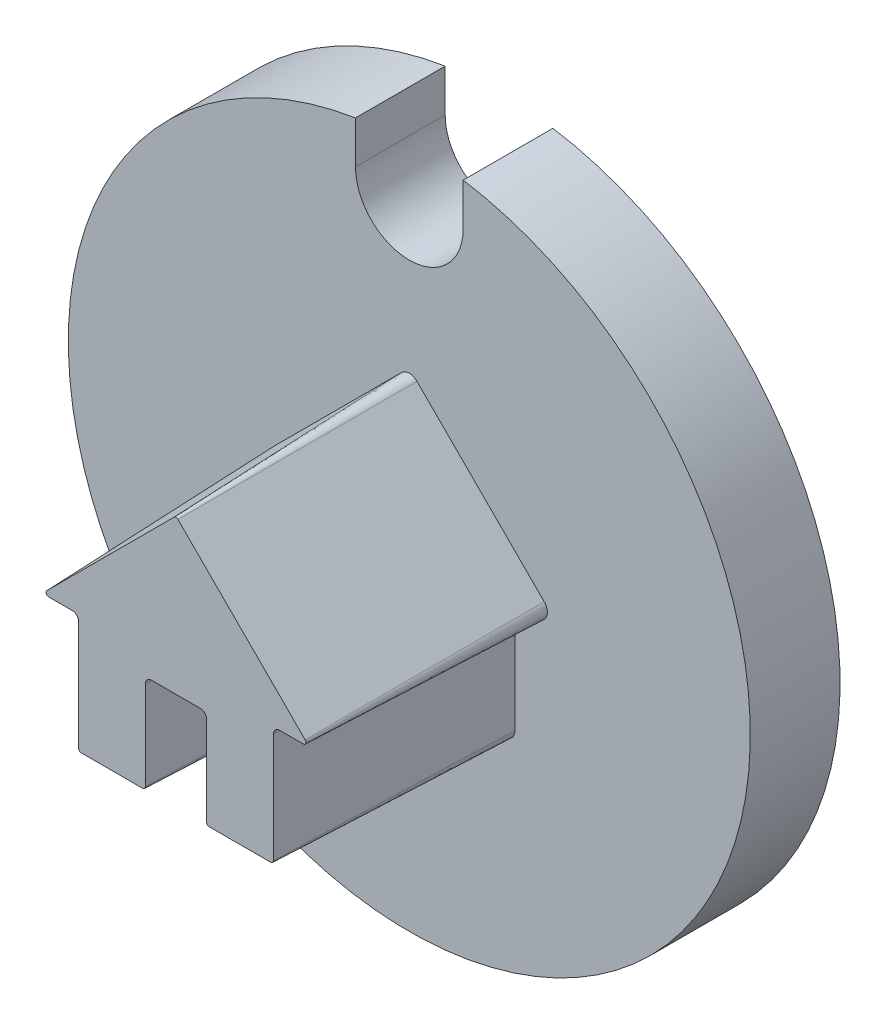
ISO-10303-21;
HEADER;
FILE_DESCRIPTION(('STEP AP214'),'2;1');
FILE_NAME('part.step','',(''),(''),'','','');
FILE_SCHEMA(('AUTOMOTIVE_DESIGN { 1 0 10303 214 1 1 1 1 }'));
ENDSEC;
DATA;
#1=APPLICATION_CONTEXT('core data for automotive mechanical design processes');
#2=APPLICATION_PROTOCOL_DEFINITION('international standard','automotive_design',2000,#1);
#3=PRODUCT_CONTEXT('',#1,'mechanical');
#4=PRODUCT('Part','Part','',(#3));
#5=PRODUCT_RELATED_PRODUCT_CATEGORY('part','',(#4));
#6=PRODUCT_DEFINITION_FORMATION('','',#4);
#7=PRODUCT_DEFINITION_CONTEXT('part definition',#1,'design');
#8=PRODUCT_DEFINITION('design','',#6,#7);
#9=PRODUCT_DEFINITION_SHAPE('','',#8);
#10=(LENGTH_UNIT() NAMED_UNIT(*) SI_UNIT(.MILLI.,.METRE.));
#11=(NAMED_UNIT(*) PLANE_ANGLE_UNIT() SI_UNIT($,.RADIAN.));
#12=(NAMED_UNIT(*) SI_UNIT($,.STERADIAN.) SOLID_ANGLE_UNIT());
#13=UNCERTAINTY_MEASURE_WITH_UNIT(LENGTH_MEASURE(1.E-05),#10,'distance_accuracy_value','');
#14=(GEOMETRIC_REPRESENTATION_CONTEXT(3) GLOBAL_UNCERTAINTY_ASSIGNED_CONTEXT((#13)) GLOBAL_UNIT_ASSIGNED_CONTEXT((#10,
#11,#12)) REPRESENTATION_CONTEXT('',''));
#15=CARTESIAN_POINT('',(0.,0.,0.));
#16=DIRECTION('',(0.,0.,1.));
#17=DIRECTION('',(1.,0.,0.));
#18=AXIS2_PLACEMENT_3D('',#15,#16,#17);
#19=CARTESIAN_POINT('',(0.,0.05,9.));
#20=DIRECTION('',(0.,-0.999390827019096,0.0348994967025009));
#21=DIRECTION('',(0.,-0.0348994967025009,-0.999390827019096));
#22=AXIS2_PLACEMENT_3D('',#19,#20,#21);
#23=PLANE('',#22);
#24=DIRECTION('',(0.0348782627423748,-0.0348782627423746,-0.998782765958718));
#25=VECTOR('',#24,1.);
#26=CARTESIAN_POINT('',(2.88834211230278,-0.125,3.98865567548976));
#27=LINE('',#26,#25);
#28=CARTESIAN_POINT('',(2.88834211230275,-0.125000000002556,3.98865567546541));
#29=VERTEX_POINT('',#28);
#30=CARTESIAN_POINT('',(2.94032711399914,-0.17698500169636,2.5));
#31=VERTEX_POINT('',#30);
#32=EDGE_CURVE('E196',#29,#31,#27,.T.);
#33=ORIENTED_EDGE('',*,*,#32,.T.);
#34=DIRECTION('',(1.,0.,0.));
#35=VECTOR('',#34,1.);
#36=CARTESIAN_POINT('',(0.,-0.17698500169636,2.5));
#37=LINE('',#36,#35);
#38=CARTESIAN_POINT('',(3.54431475582672,-0.176985001698563,2.50000000004093));
#39=VERTEX_POINT('',#38);
#40=EDGE_CURVE('E200',#31,#39,#37,.T.);
#41=ORIENTED_EDGE('',*,*,#40,.T.);
#42=DIRECTION('',(0.,0.034899496702501,0.999390827019096));
#43=VECTOR('',#42,1.);
#44=CARTESIAN_POINT('',(3.54431475582779,-17425.7282633075,-499000.));
#45=LINE('',#44,#43);
#46=CARTESIAN_POINT('',(3.54431475582672,0.0499999999973937,9.00000000003934));
#47=VERTEX_POINT('',#46);
#48=EDGE_CURVE('E301',#47,#39,#45,.F.);
#49=ORIENTED_EDGE('',*,*,#48,.F.);
#50=DIRECTION('',(1.,0.,0.));
#51=VECTOR('',#50,1.);
#52=CARTESIAN_POINT('',(0.,0.05,9.));
#53=LINE('',#52,#51);
#54=CARTESIAN_POINT('',(2.88834211230278,0.0499999999986386,8.9999999999967));
#55=VERTEX_POINT('',#54);
#56=EDGE_CURVE('E206',#47,#55,#53,.F.);
#57=ORIENTED_EDGE('',*,*,#56,.T.);
#58=DIRECTION('',(0.,-0.0348994967025009,-0.999390827019096));
#59=VECTOR('',#58,1.);
#60=CARTESIAN_POINT('',(2.88834211230385,17425.1996894567,499000.));
#61=LINE('',#60,#59);
#62=EDGE_CURVE('E203',#55,#29,#61,.T.);
#63=ORIENTED_EDGE('',*,*,#62,.T.);
#64=EDGE_LOOP('',(#33,#41,#49,#57,#63));
#65=FACE_BOUND('',#64,.T.);
#66=ADVANCED_FACE('F17',(#65),#23,.T.);
#67=CARTESIAN_POINT('',(0.,-3.25803822726011,9.));
#68=DIRECTION('',(0.,-0.999390827019096,0.0348994967025009));
#69=DIRECTION('',(0.,-0.0348994967025009,-0.999390827019096));
#70=AXIS2_PLACEMENT_3D('',#67,#68,#69);
#71=PLANE('',#70);
#72=DIRECTION('',(0.,0.034899496702501,0.999390827019096));
#73=VECTOR('',#72,1.);
#74=CARTESIAN_POINT('',(0.929075389170224,-17429.0363015348,-499000.));
#75=LINE('',#74,#73);
#76=CARTESIAN_POINT('',(0.929075389169157,-3.48502322895503,2.50000000004093));
#77=VERTEX_POINT('',#76);
#78=CARTESIAN_POINT('',(0.929075389169157,-3.25803822725881,9.00000000003934));
#79=VERTEX_POINT('',#78);
#80=EDGE_CURVE('E297',#77,#79,#75,.T.);
#81=ORIENTED_EDGE('',*,*,#80,.F.);
#82=DIRECTION('',(1.,0.,0.));
#83=VECTOR('',#82,1.);
#84=CARTESIAN_POINT('',(0.,-3.48502322895647,2.5));
#85=LINE('',#84,#83);
#86=CARTESIAN_POINT('',(2.63834211230278,-3.48502322895601,2.50000000004093));
#87=VERTEX_POINT('',#86);
#88=EDGE_CURVE('E226',#77,#87,#85,.T.);
#89=ORIENTED_EDGE('',*,*,#88,.T.);
#90=DIRECTION('',(0.,0.034899496702501,0.999390827019096));
#91=VECTOR('',#90,1.);
#92=CARTESIAN_POINT('',(2.63834211230385,-17429.0363015348,-499000.));
#93=LINE('',#92,#91);
#94=CARTESIAN_POINT('',(2.63834211230278,-3.25803822726005,9.00000000003934));
#95=VERTEX_POINT('',#94);
#96=EDGE_CURVE('E300',#95,#87,#93,.F.);
#97=ORIENTED_EDGE('',*,*,#96,.F.);
#98=DIRECTION('',(1.,0.,0.));
#99=VECTOR('',#98,1.);
#100=CARTESIAN_POINT('',(0.,-3.25803822726011,9.));
#101=LINE('',#100,#99);
#102=EDGE_CURVE('E224',#95,#79,#101,.F.);
#103=ORIENTED_EDGE('',*,*,#102,.T.);
#104=EDGE_LOOP('',(#81,#89,#97,#103));
#105=FACE_BOUND('',#104,.T.);
#106=ADVANCED_FACE('F557',(#105),#71,.T.);
#107=CARTESIAN_POINT('',(0.,-0.526478138100356,9.));
#108=DIRECTION('',(0.,-0.999390827019096,0.0348994967025009));
#109=DIRECTION('',(0.,-0.0348994967025009,-0.999390827019096));
#110=AXIS2_PLACEMENT_3D('',#107,#108,#109);
#111=PLANE('',#110);
#112=DIRECTION('',(1.,0.,0.));
#113=VECTOR('',#112,1.);
#114=CARTESIAN_POINT('',(0.,-0.753463139796716,2.5));
#115=LINE('',#114,#113);
#116=CARTESIAN_POINT('',(-0.627090387472796,-0.753463139796716,2.5));
#117=VERTEX_POINT('',#116);
#118=CARTESIAN_POINT('',(0.627090387472796,-0.753463139796716,2.5));
#119=VERTEX_POINT('',#118);
#120=EDGE_CURVE('E238',#117,#119,#115,.T.);
#121=ORIENTED_EDGE('',*,*,#120,.T.);
#122=DIRECTION('',(0.0348782627423749,0.0348782627423746,0.998782765958718));
#123=VECTOR('',#122,1.);
#124=CARTESIAN_POINT('',(0.627090387472796,-0.753463139796716,2.5));
#125=LINE('',#124,#123);
#126=CARTESIAN_POINT('',(0.679075389169608,-0.701478138100494,3.98865567549641));
#127=VERTEX_POINT('',#126);
#128=EDGE_CURVE('E235',#119,#127,#125,.T.);
#129=ORIENTED_EDGE('',*,*,#128,.T.);
#130=DIRECTION('',(0.,-0.034899496702501,-0.999390827019096));
#131=VECTOR('',#130,1.);
#132=CARTESIAN_POINT('',(0.679075389170224,17424.6232113186,499000.));
#133=LINE('',#132,#131);
#134=CARTESIAN_POINT('',(0.679075389169157,-0.5264781380997,8.9999999999967));
#135=VERTEX_POINT('',#134);
#136=EDGE_CURVE('E296',#127,#135,#133,.F.);
#137=ORIENTED_EDGE('',*,*,#136,.T.);
#138=DIRECTION('',(1.,0.,0.));
#139=VECTOR('',#138,1.);
#140=CARTESIAN_POINT('',(0.,-0.526478138100356,9.));
#141=LINE('',#140,#139);
#142=CARTESIAN_POINT('',(-0.679075389169157,-0.526478138101717,8.9999999999967));
#143=VERTEX_POINT('',#142);
#144=EDGE_CURVE('E317',#135,#143,#141,.F.);
#145=ORIENTED_EDGE('',*,*,#144,.T.);
#146=DIRECTION('',(0.,-0.034899496702501,-0.999390827019096));
#147=VECTOR('',#146,1.);
#148=CARTESIAN_POINT('',(-0.67907538916809,17424.6232113186,499000.));
#149=LINE('',#148,#147);
#150=CARTESIAN_POINT('',(-0.679075389170029,-0.701478138101578,3.98865567550846));
#151=VERTEX_POINT('',#150);
#152=EDGE_CURVE('E289',#143,#151,#149,.T.);
#153=ORIENTED_EDGE('',*,*,#152,.T.);
#154=DIRECTION('',(0.0348782627423749,-0.0348782627423746,-0.998782765958718));
#155=VECTOR('',#154,1.);
#156=CARTESIAN_POINT('',(-0.679075389169157,-0.701478138100355,3.98865567548978));
#157=LINE('',#156,#155);
#158=EDGE_CURVE('E240',#151,#117,#157,.T.);
#159=ORIENTED_EDGE('',*,*,#158,.T.);
#160=EDGE_LOOP('',(#121,#129,#137,#145,#153,#159));
#161=FACE_BOUND('',#160,.T.);
#162=ADVANCED_FACE('F377',(#161),#111,.T.);
#163=CARTESIAN_POINT('',(0.,0.05,9.));
#164=DIRECTION('',(0.,-0.999390827019096,0.0348994967025009));
#165=DIRECTION('',(0.,-0.0348994967025009,-0.999390827019096));
#166=AXIS2_PLACEMENT_3D('',#163,#164,#165);
#167=PLANE('',#166);
#168=DIRECTION('',(0.0348782627423748,0.0348782627423746,0.998782765958718));
#169=VECTOR('',#168,1.);
#170=CARTESIAN_POINT('',(-2.94032711399914,-0.17698500169636,2.5));
#171=LINE('',#170,#169);
#172=CARTESIAN_POINT('',(-2.94032711399914,-0.17698500169636,2.5));
#173=VERTEX_POINT('',#172);
#174=CARTESIAN_POINT('',(-2.88834211230299,-0.125000000001653,3.98865567545858));
#175=VERTEX_POINT('',#174);
#176=EDGE_CURVE('E177',#173,#175,#171,.T.);
#177=ORIENTED_EDGE('',*,*,#176,.T.);
#178=DIRECTION('',(0.,-0.0348994967025009,-0.999390827019096));
#179=VECTOR('',#178,1.);
#180=CARTESIAN_POINT('',(-2.88834211230171,17425.1996894567,499000.));
#181=LINE('',#180,#179);
#182=CARTESIAN_POINT('',(-2.88834211230278,0.0500000000006551,8.9999999999967));
#183=VERTEX_POINT('',#182);
#184=EDGE_CURVE('E264',#175,#183,#181,.F.);
#185=ORIENTED_EDGE('',*,*,#184,.T.);
#186=DIRECTION('',(1.,0.,0.));
#187=VECTOR('',#186,1.);
#188=CARTESIAN_POINT('',(0.,0.05,9.));
#189=LINE('',#188,#187);
#190=CARTESIAN_POINT('',(-3.54431475582672,0.0499999999956174,9.00000000001091));
#191=VERTEX_POINT('',#190);
#192=EDGE_CURVE('E288',#191,#183,#189,.T.);
#193=ORIENTED_EDGE('',*,*,#192,.F.);
#194=DIRECTION('',(0.,0.034899496702501,0.999390827019096));
#195=VECTOR('',#194,1.);
#196=CARTESIAN_POINT('',(-3.54431475582565,-17425.7282633075,-499000.));
#197=LINE('',#196,#195);
#198=CARTESIAN_POINT('',(-3.54431475582672,-0.176985001698563,2.50000000004093));
#199=VERTEX_POINT('',#198);
#200=EDGE_CURVE('E308',#199,#191,#197,.T.);
#201=ORIENTED_EDGE('',*,*,#200,.F.);
#202=DIRECTION('',(1.,0.,0.));
#203=VECTOR('',#202,1.);
#204=CARTESIAN_POINT('',(0.,-0.17698500169636,2.5));
#205=LINE('',#204,#203);
#206=EDGE_CURVE('E233',#199,#173,#205,.T.);
#207=ORIENTED_EDGE('',*,*,#206,.T.);
#208=EDGE_LOOP('',(#177,#185,#193,#201,#207));
#209=FACE_BOUND('',#208,.T.);
#210=ADVANCED_FACE('F465',(#209),#167,.T.);
#211=CARTESIAN_POINT('',(0.,-3.25803822726011,9.));
#212=DIRECTION('',(0.,-0.999390827019096,0.0348994967025009));
#213=DIRECTION('',(0.,-0.0348994967025009,-0.999390827019096));
#214=AXIS2_PLACEMENT_3D('',#211,#212,#213);
#215=PLANE('',#214);
#216=DIRECTION('',(1.,0.,0.));
#217=VECTOR('',#216,1.);
#218=CARTESIAN_POINT('',(0.,-3.48502322895647,2.5));
#219=LINE('',#218,#217);
#220=CARTESIAN_POINT('',(-2.63834211230278,-3.48502322895601,2.50000000004093));
#221=VERTEX_POINT('',#220);
#222=CARTESIAN_POINT('',(-0.929075389169154,-3.48502322895601,2.50000000004093));
#223=VERTEX_POINT('',#222);
#224=EDGE_CURVE('E311',#221,#223,#219,.T.);
#225=ORIENTED_EDGE('',*,*,#224,.T.);
#226=DIRECTION('',(0.,0.034899496702501,0.999390827019096));
#227=VECTOR('',#226,1.);
#228=CARTESIAN_POINT('',(-0.92907538894367,-17429.0363015348,-499000.));
#229=LINE('',#228,#227);
#230=CARTESIAN_POINT('',(-0.929075389169157,-3.25803822726005,9.00000000003934));
#231=VERTEX_POINT('',#230);
#232=EDGE_CURVE('E292',#231,#223,#229,.F.);
#233=ORIENTED_EDGE('',*,*,#232,.F.);
#234=DIRECTION('',(1.,0.,0.));
#235=VECTOR('',#234,1.);
#236=CARTESIAN_POINT('',(0.,-3.25803822726011,9.));
#237=LINE('',#236,#235);
#238=CARTESIAN_POINT('',(-2.63834211230278,-3.25803822726183,9.00000000001091));
#239=VERTEX_POINT('',#238);
#240=EDGE_CURVE('E284',#239,#231,#237,.T.);
#241=ORIENTED_EDGE('',*,*,#240,.F.);
#242=DIRECTION('',(0.,0.034899496702501,0.999390827019096));
#243=VECTOR('',#242,1.);
#244=CARTESIAN_POINT('',(-2.63834211230171,-17429.0363015348,-499000.));
#245=LINE('',#244,#243);
#246=EDGE_CURVE('E260',#221,#239,#245,.T.);
#247=ORIENTED_EDGE('',*,*,#246,.F.);
#248=EDGE_LOOP('',(#225,#233,#241,#247));
#249=FACE_BOUND('',#248,.T.);
#250=ADVANCED_FACE('F570',(#249),#215,.T.);
#251=CARTESIAN_POINT('',(-3.54431475582672,0.125,2.50000000016826));
#252=DIRECTION('',(0.,0.,-1.));
#253=DIRECTION('',(-1.,0.,0.));
#254=AXIS2_PLACEMENT_3D('',#251,#252,#253);
#255=CONICAL_SURFACE('',#254,0.301985001693198,0.0349065850400188);
#256=DIRECTION('',(0.0246776707783359,-0.0246776707783359,0.999390827019096));
#257=VECTOR('',#256,1.);
#258=CARTESIAN_POINT('',(-3.59734776441571,0.178033008588988,9.));
#259=LINE('',#258,#257);
#260=CARTESIAN_POINT('',(-3.75785039834288,0.338535642516152,2.49999999999886));
#261=VERTEX_POINT('',#260);
#262=CARTESIAN_POINT('',(-3.59734776441553,0.178033008588808,9.00000000000728));
#263=VERTEX_POINT('',#262);
#264=EDGE_CURVE('E446',#261,#263,#259,.T.);
#265=ORIENTED_EDGE('',*,*,#264,.F.);
#266=CARTESIAN_POINT('',(-3.54431475582672,0.125,2.49999999999773));
#267=DIRECTION('',(0.,0.,-1.));
#268=DIRECTION('',(-1.,0.,0.));
#269=AXIS2_PLACEMENT_3D('',#266,#267,#268);
#270=CIRCLE('',#269,0.301985001699153);
#271=EDGE_CURVE('E20',#261,#199,#270,.F.);
#272=ORIENTED_EDGE('',*,*,#271,.T.);
#273=ORIENTED_EDGE('',*,*,#200,.T.);
#274=CARTESIAN_POINT('',(-3.54431475582672,0.125,9.00000000001455));
#275=DIRECTION('',(0.,0.,-1.));
#276=DIRECTION('',(-1.,0.,0.));
#277=AXIS2_PLACEMENT_3D('',#274,#275,#276);
#278=CIRCLE('',#277,0.0750000000013453);
#279=EDGE_CURVE('E285',#263,#191,#278,.F.);
#280=ORIENTED_EDGE('',*,*,#279,.F.);
#281=EDGE_LOOP('',(#265,#272,#273,#280));
#282=FACE_BOUND('',#281,.T.);
#283=ADVANCED_FACE('F467',(#282),#255,.T.);
#284=CARTESIAN_POINT('',(0.,3.66931475582672,2.50000000016826));
#285=DIRECTION('',(0.,0.,-1.));
#286=DIRECTION('',(-1.,0.,0.));
#287=AXIS2_PLACEMENT_3D('',#284,#285,#286);
#288=CONICAL_SURFACE('',#287,0.301985001691207,0.0349065850400188);
#289=DIRECTION('',(-0.0246776707783359,-0.0246776707783359,0.999390827019096));
#290=VECTOR('',#289,1.);
#291=CARTESIAN_POINT('',(0.0530330085889894,3.72234776441571,9.));
#292=LINE('',#291,#290);
#293=CARTESIAN_POINT('',(0.213535642516154,3.88285039834288,2.49999999999886));
#294=VERTEX_POINT('',#293);
#295=CARTESIAN_POINT('',(0.0530330085888099,3.72234776441553,9.00000000000728));
#296=VERTEX_POINT('',#295);
#297=EDGE_CURVE('E353',#294,#296,#292,.T.);
#298=ORIENTED_EDGE('',*,*,#297,.F.);
#299=CARTESIAN_POINT('',(0.,3.66931475582672,2.49999999999773));
#300=DIRECTION('',(0.,0.,-1.));
#301=DIRECTION('',(-1.,0.,0.));
#302=AXIS2_PLACEMENT_3D('',#299,#300,#301);
#303=CIRCLE('',#302,0.301985001697162);
#304=CARTESIAN_POINT('',(-0.213535642516155,3.88285039834287,2.49999999999886));
#305=VERTEX_POINT('',#304);
#306=EDGE_CURVE('E302',#294,#305,#303,.F.);
#307=ORIENTED_EDGE('',*,*,#306,.T.);
#308=DIRECTION('',(0.0246776707783359,-0.0246776707783359,0.999390827019096));
#309=VECTOR('',#308,1.);
#310=CARTESIAN_POINT('',(-0.0530330085889909,3.72234776441571,9.));
#311=LINE('',#310,#309);
#312=CARTESIAN_POINT('',(-0.0530330085888112,3.72234776441553,9.00000000000728));
#313=VERTEX_POINT('',#312);
#314=EDGE_CURVE('E356',#313,#305,#311,.F.);
#315=ORIENTED_EDGE('',*,*,#314,.F.);
#316=CARTESIAN_POINT('',(0.,3.66931475582672,9.00000000001455));
#317=DIRECTION('',(0.,0.,-1.));
#318=DIRECTION('',(-1.,0.,0.));
#319=AXIS2_PLACEMENT_3D('',#316,#317,#318);
#320=CIRCLE('',#319,0.0749999999993543);
#321=EDGE_CURVE('E265',#296,#313,#320,.F.);
#322=ORIENTED_EDGE('',*,*,#321,.F.);
#323=EDGE_LOOP('',(#298,#307,#315,#322));
#324=FACE_BOUND('',#323,.T.);
#325=ADVANCED_FACE('F473',(#324),#288,.T.);
#326=CARTESIAN_POINT('',(3.54431475582672,0.125,2.50000000016826));
#327=DIRECTION('',(0.,0.,-1.));
#328=DIRECTION('',(-1.,0.,0.));
#329=AXIS2_PLACEMENT_3D('',#326,#327,#328);
#330=CONICAL_SURFACE('',#329,0.301985001692769,0.0349065850400188);
#331=ORIENTED_EDGE('',*,*,#48,.T.);
#332=CARTESIAN_POINT('',(3.54431475582672,0.125,2.49999999999773));
#333=DIRECTION('',(0.,0.,-1.));
#334=DIRECTION('',(-1.,0.,0.));
#335=AXIS2_PLACEMENT_3D('',#332,#333,#334);
#336=CIRCLE('',#335,0.301985001698724);
#337=CARTESIAN_POINT('',(3.75785039834288,0.33853564251615,2.49999999999886));
#338=VERTEX_POINT('',#337);
#339=EDGE_CURVE('E223',#39,#338,#336,.F.);
#340=ORIENTED_EDGE('',*,*,#339,.T.);
#341=DIRECTION('',(-0.0246776707783359,-0.0246776707783359,0.999390827019096));
#342=VECTOR('',#341,1.);
#343=CARTESIAN_POINT('',(3.59734776441571,0.178033008588986,9.));
#344=LINE('',#343,#342);
#345=CARTESIAN_POINT('',(3.59734776441553,0.178033008588806,9.00000000000728));
#346=VERTEX_POINT('',#345);
#347=EDGE_CURVE('E340',#346,#338,#344,.F.);
#348=ORIENTED_EDGE('',*,*,#347,.F.);
#349=CARTESIAN_POINT('',(3.54431475582672,0.125,9.00000000001455));
#350=DIRECTION('',(0.,0.,-1.));
#351=DIRECTION('',(-1.,0.,0.));
#352=AXIS2_PLACEMENT_3D('',#349,#350,#351);
#353=CIRCLE('',#352,0.075000000000916);
#354=EDGE_CURVE('E267',#47,#346,#353,.F.);
#355=ORIENTED_EDGE('',*,*,#354,.F.);
#356=EDGE_LOOP('',(#331,#340,#348,#355));
#357=FACE_BOUND('',#356,.T.);
#358=ADVANCED_FACE('F479',(#357),#330,.T.);
#359=CARTESIAN_POINT('',(2.88834211230278,-0.125,8.99999999995771));
#360=DIRECTION('',(0.,0.,1.));
#361=DIRECTION('',(1.,0.,0.));
#362=AXIS2_PLACEMENT_3D('',#359,#360,#361);
#363=CONICAL_SURFACE('',#362,0.174999999995748,0.0349065849085887);
#364=DIRECTION('',(0.0348994967025009,0.,-0.999390827019096));
#365=VECTOR('',#364,1.);
#366=CARTESIAN_POINT('',(2.71334211230278,-0.125,9.));
#367=LINE('',#366,#365);
#368=CARTESIAN_POINT('',(2.71334211230253,-0.125,9.00000000000728));
#369=VERTEX_POINT('',#368);
#370=EDGE_CURVE('E332',#29,#369,#367,.F.);
#371=ORIENTED_EDGE('',*,*,#370,.F.);
#372=ORIENTED_EDGE('',*,*,#62,.F.);
#373=CARTESIAN_POINT('',(2.88834211230278,-0.125,9.00000000001455));
#374=DIRECTION('',(0.,0.,1.));
#375=DIRECTION('',(1.,0.,0.));
#376=AXIS2_PLACEMENT_3D('',#373,#374,#375);
#377=CIRCLE('',#376,0.174999999997733);
#378=EDGE_CURVE('E269',#369,#55,#377,.F.);
#379=ORIENTED_EDGE('',*,*,#378,.F.);
#380=EDGE_LOOP('',(#371,#372,#379));
#381=FACE_BOUND('',#380,.T.);
#382=ADVANCED_FACE('F330',(#381),#363,.F.);
#383=CARTESIAN_POINT('',(2.63834211230278,-3.18303822726011,2.50000000016826));
#384=DIRECTION('',(0.,0.,-1.));
#385=DIRECTION('',(-1.,0.,0.));
#386=AXIS2_PLACEMENT_3D('',#383,#384,#385);
#387=CONICAL_SURFACE('',#386,0.301985001690611,0.0349065850400188);
#388=ORIENTED_EDGE('',*,*,#96,.T.);
#389=CARTESIAN_POINT('',(2.63834211230278,-3.18303822726011,2.49999999999773));
#390=DIRECTION('',(0.,0.,-1.));
#391=DIRECTION('',(-1.,0.,0.));
#392=AXIS2_PLACEMENT_3D('',#389,#390,#391);
#393=CIRCLE('',#392,0.301985001696566);
#394=CARTESIAN_POINT('',(2.94032711399918,-3.18303822726011,2.49999999999886));
#395=VERTEX_POINT('',#394);
#396=EDGE_CURVE('E298',#87,#395,#393,.F.);
#397=ORIENTED_EDGE('',*,*,#396,.T.);
#398=DIRECTION('',(0.0348994967025009,0.,-0.999390827019096));
#399=VECTOR('',#398,1.);
#400=CARTESIAN_POINT('',(2.71334211230278,-3.18303822726011,9.));
#401=LINE('',#400,#399);
#402=CARTESIAN_POINT('',(2.71334211230253,-3.18303822726011,9.00000000000728));
#403=VERTEX_POINT('',#402);
#404=EDGE_CURVE('E214',#403,#395,#401,.T.);
#405=ORIENTED_EDGE('',*,*,#404,.F.);
#406=CARTESIAN_POINT('',(2.63834211230278,-3.18303822726011,9.00000000001455));
#407=DIRECTION('',(0.,0.,-1.));
#408=DIRECTION('',(-1.,0.,0.));
#409=AXIS2_PLACEMENT_3D('',#406,#407,#408);
#410=CIRCLE('',#409,0.0749999999987576);
#411=EDGE_CURVE('E272',#95,#403,#410,.F.);
#412=ORIENTED_EDGE('',*,*,#411,.F.);
#413=EDGE_LOOP('',(#388,#397,#405,#412));
#414=FACE_BOUND('',#413,.T.);
#415=ADVANCED_FACE('F487',(#414),#387,.T.);
#416=CARTESIAN_POINT('',(0.929075389169157,-3.18303822726011,2.50000000016826));
#417=DIRECTION('',(0.,0.,-1.));
#418=DIRECTION('',(-1.,0.,0.));
#419=AXIS2_PLACEMENT_3D('',#416,#417,#418);
#420=CONICAL_SURFACE('',#419,0.301985001691804,0.0349065850400188);
#421=DIRECTION('',(0.0348994967025009,0.,0.999390827019096));
#422=VECTOR('',#421,1.);
#423=CARTESIAN_POINT('',(0.854075389169157,-3.18303822726011,9.));
#424=LINE('',#423,#422);
#425=CARTESIAN_POINT('',(0.627090387472757,-3.18303822726011,2.49999999999886));
#426=VERTEX_POINT('',#425);
#427=CARTESIAN_POINT('',(0.854075389169411,-3.18303822726011,9.00000000000728));
#428=VERTEX_POINT('',#427);
#429=EDGE_CURVE('E338',#426,#428,#424,.T.);
#430=ORIENTED_EDGE('',*,*,#429,.F.);
#431=CARTESIAN_POINT('',(0.929075389169157,-3.18303822726011,2.49999999999773));
#432=DIRECTION('',(0.,0.,-1.));
#433=DIRECTION('',(-1.,0.,0.));
#434=AXIS2_PLACEMENT_3D('',#431,#432,#433);
#435=CIRCLE('',#434,0.301985001697759);
#436=EDGE_CURVE('E293',#426,#77,#435,.F.);
#437=ORIENTED_EDGE('',*,*,#436,.T.);
#438=ORIENTED_EDGE('',*,*,#80,.T.);
#439=CARTESIAN_POINT('',(0.929075389169157,-3.18303822726011,9.00000000001455));
#440=DIRECTION('',(0.,0.,-1.));
#441=DIRECTION('',(-1.,0.,0.));
#442=AXIS2_PLACEMENT_3D('',#439,#440,#441);
#443=CIRCLE('',#442,0.0749999999999507);
#444=EDGE_CURVE('E274',#428,#79,#443,.F.);
#445=ORIENTED_EDGE('',*,*,#444,.F.);
#446=EDGE_LOOP('',(#430,#437,#438,#445));
#447=FACE_BOUND('',#446,.T.);
#448=ADVANCED_FACE('F542',(#447),#420,.T.);
#449=CARTESIAN_POINT('',(0.679075389169157,-0.701478138100355,8.99999999995771));
#450=DIRECTION('',(0.,0.,1.));
#451=DIRECTION('',(1.,0.,0.));
#452=AXIS2_PLACEMENT_3D('',#449,#450,#451);
#453=CONICAL_SURFACE('',#452,0.174999999998107,0.034906584925938);
#454=ORIENTED_EDGE('',*,*,#136,.F.);
#455=DIRECTION('',(0.0348994967025009,0.,0.999390827019096));
#456=VECTOR('',#455,1.);
#457=CARTESIAN_POINT('',(0.854075389169157,-0.701478138100355,9.));
#458=LINE('',#457,#456);
#459=CARTESIAN_POINT('',(0.854075389169411,-0.701478138100355,9.00000000000728));
#460=VERTEX_POINT('',#459);
#461=EDGE_CURVE('E401',#460,#127,#458,.F.);
#462=ORIENTED_EDGE('',*,*,#461,.F.);
#463=CARTESIAN_POINT('',(0.679075389169157,-0.701478138100355,9.00000000001455));
#464=DIRECTION('',(0.,0.,1.));
#465=DIRECTION('',(1.,0.,0.));
#466=AXIS2_PLACEMENT_3D('',#463,#464,#465);
#467=CIRCLE('',#466,0.175000000000092);
#468=EDGE_CURVE('E277',#135,#460,#467,.F.);
#469=ORIENTED_EDGE('',*,*,#468,.F.);
#470=EDGE_LOOP('',(#454,#462,#469));
#471=FACE_BOUND('',#470,.T.);
#472=ADVANCED_FACE('F539',(#471),#453,.F.);
#473=CARTESIAN_POINT('',(-0.929075389169158,-3.18303822726011,2.50000000016826));
#474=DIRECTION('',(0.,0.,-1.));
#475=DIRECTION('',(-1.,0.,0.));
#476=AXIS2_PLACEMENT_3D('',#473,#474,#475);
#477=CONICAL_SURFACE('',#476,0.301985001690612,0.0349065850400188);
#478=ORIENTED_EDGE('',*,*,#232,.T.);
#479=CARTESIAN_POINT('',(-0.929075389169158,-3.18303822726011,2.49999999999773));
#480=DIRECTION('',(0.,0.,-1.));
#481=DIRECTION('',(-1.,0.,0.));
#482=AXIS2_PLACEMENT_3D('',#479,#480,#481);
#483=CIRCLE('',#482,0.301985001696567);
#484=CARTESIAN_POINT('',(-0.627090387472757,-3.18303822726011,2.49999999999886));
#485=VERTEX_POINT('',#484);
#486=EDGE_CURVE('E290',#223,#485,#483,.F.);
#487=ORIENTED_EDGE('',*,*,#486,.T.);
#488=DIRECTION('',(0.0348994967025009,0.,-0.999390827019096));
#489=VECTOR('',#488,1.);
#490=CARTESIAN_POINT('',(-0.854075389169157,-3.18303822726011,9.));
#491=LINE('',#490,#489);
#492=CARTESIAN_POINT('',(-0.854075389169411,-3.18303822726011,9.00000000000728));
#493=VERTEX_POINT('',#492);
#494=EDGE_CURVE('E387',#493,#485,#491,.T.);
#495=ORIENTED_EDGE('',*,*,#494,.F.);
#496=CARTESIAN_POINT('',(-0.929075389169158,-3.18303822726011,9.00000000001455));
#497=DIRECTION('',(0.,0.,-1.));
#498=DIRECTION('',(-1.,0.,0.));
#499=AXIS2_PLACEMENT_3D('',#496,#497,#498);
#500=CIRCLE('',#499,0.0749999999987589);
#501=EDGE_CURVE('E282',#231,#493,#500,.F.);
#502=ORIENTED_EDGE('',*,*,#501,.F.);
#503=EDGE_LOOP('',(#478,#487,#495,#502));
#504=FACE_BOUND('',#503,.T.);
#505=ADVANCED_FACE('F412',(#504),#477,.T.);
#506=CARTESIAN_POINT('',(-0.679075389169157,-0.701478138100355,8.99999999995771));
#507=DIRECTION('',(0.,0.,1.));
#508=DIRECTION('',(1.,0.,0.));
#509=AXIS2_PLACEMENT_3D('',#506,#507,#508);
#510=CONICAL_SURFACE('',#509,0.174999999995749,0.0349065849249981);
#511=DIRECTION('',(0.0348994967025009,0.,-0.999390827019096));
#512=VECTOR('',#511,1.);
#513=CARTESIAN_POINT('',(-0.854075389169157,-0.701478138100355,9.));
#514=LINE('',#513,#512);
#515=CARTESIAN_POINT('',(-0.854075389169411,-0.701478138100355,9.00000000000728));
#516=VERTEX_POINT('',#515);
#517=EDGE_CURVE('E381',#151,#516,#514,.F.);
#518=ORIENTED_EDGE('',*,*,#517,.F.);
#519=ORIENTED_EDGE('',*,*,#152,.F.);
#520=CARTESIAN_POINT('',(-0.679075389169157,-0.701478138100355,9.00000000001455));
#521=DIRECTION('',(0.,0.,1.));
#522=DIRECTION('',(1.,0.,0.));
#523=AXIS2_PLACEMENT_3D('',#520,#521,#522);
#524=CIRCLE('',#523,0.174999999997734);
#525=EDGE_CURVE('E279',#516,#143,#524,.F.);
#526=ORIENTED_EDGE('',*,*,#525,.F.);
#527=EDGE_LOOP('',(#518,#519,#526));
#528=FACE_BOUND('',#527,.T.);
#529=ADVANCED_FACE('F382',(#528),#510,.F.);
#530=CARTESIAN_POINT('',(0.,-0.059584240176571,9.));
#531=DIRECTION('',(0.,0.,1.));
#532=DIRECTION('',(1.,0.,0.));
#533=AXIS2_PLACEMENT_3D('',#530,#531,#532);
#534=PLANE('',#533);
#535=ORIENTED_EDGE('',*,*,#321,.T.);
#536=DIRECTION('',(-0.707106781186547,-0.707106781186547,0.));
#537=VECTOR('',#536,1.);
#538=CARTESIAN_POINT('',(-1.91748250659063,1.85789826641407,9.));
#539=LINE('',#538,#537);
#540=EDGE_CURVE('E257',#263,#313,#539,.F.);
#541=ORIENTED_EDGE('',*,*,#540,.F.);
#542=ORIENTED_EDGE('',*,*,#279,.T.);
#543=ORIENTED_EDGE('',*,*,#192,.T.);
#544=CARTESIAN_POINT('',(-2.88834211230278,-0.125,9.00000000001455));
#545=DIRECTION('',(0.,0.,1.));
#546=DIRECTION('',(1.,0.,0.));
#547=AXIS2_PLACEMENT_3D('',#544,#545,#546);
#548=CIRCLE('',#547,0.175000000000092);
#549=CARTESIAN_POINT('',(-2.71334211230253,-0.125,9.00000000000728));
#550=VERTEX_POINT('',#549);
#551=EDGE_CURVE('E261',#183,#550,#548,.F.);
#552=ORIENTED_EDGE('',*,*,#551,.T.);
#553=DIRECTION('',(0.,1.,0.));
#554=VECTOR('',#553,1.);
#555=CARTESIAN_POINT('',(-2.71334211230278,-0.059584240176571,9.));
#556=LINE('',#555,#554);
#557=CARTESIAN_POINT('',(-2.71334211230253,-3.18303822726011,9.00000000000728));
#558=VERTEX_POINT('',#557);
#559=EDGE_CURVE('E386',#558,#550,#556,.T.);
#560=ORIENTED_EDGE('',*,*,#559,.F.);
#561=CARTESIAN_POINT('',(-2.63834211230278,-3.18303822726011,9.00000000001455));
#562=DIRECTION('',(0.,0.,-1.));
#563=DIRECTION('',(-1.,0.,0.));
#564=AXIS2_PLACEMENT_3D('',#561,#562,#563);
#565=CIRCLE('',#564,0.0749999999999511);
#566=EDGE_CURVE('E258',#239,#558,#565,.T.);
#567=ORIENTED_EDGE('',*,*,#566,.F.);
#568=ORIENTED_EDGE('',*,*,#240,.T.);
#569=ORIENTED_EDGE('',*,*,#501,.T.);
#570=DIRECTION('',(0.,1.,0.));
#571=VECTOR('',#570,1.);
#572=CARTESIAN_POINT('',(-0.854075389169157,-0.059584240176571,9.));
#573=LINE('',#572,#571);
#574=EDGE_CURVE('E392',#516,#493,#573,.F.);
#575=ORIENTED_EDGE('',*,*,#574,.F.);
#576=ORIENTED_EDGE('',*,*,#525,.T.);
#577=ORIENTED_EDGE('',*,*,#144,.F.);
#578=ORIENTED_EDGE('',*,*,#468,.T.);
#579=DIRECTION('',(0.,1.,0.));
#580=VECTOR('',#579,1.);
#581=CARTESIAN_POINT('',(0.854075389169157,-0.059584240176571,9.));
#582=LINE('',#581,#580);
#583=EDGE_CURVE('E399',#428,#460,#582,.T.);
#584=ORIENTED_EDGE('',*,*,#583,.F.);
#585=ORIENTED_EDGE('',*,*,#444,.T.);
#586=ORIENTED_EDGE('',*,*,#102,.F.);
#587=ORIENTED_EDGE('',*,*,#411,.T.);
#588=DIRECTION('',(0.,1.,0.));
#589=VECTOR('',#588,1.);
#590=CARTESIAN_POINT('',(2.71334211230278,-0.059584240176571,9.));
#591=LINE('',#590,#589);
#592=EDGE_CURVE('E335',#369,#403,#591,.F.);
#593=ORIENTED_EDGE('',*,*,#592,.F.);
#594=ORIENTED_EDGE('',*,*,#378,.T.);
#595=ORIENTED_EDGE('',*,*,#56,.F.);
#596=ORIENTED_EDGE('',*,*,#354,.T.);
#597=DIRECTION('',(-0.707106781186547,0.707106781186547,0.));
#598=VECTOR('',#597,1.);
#599=CARTESIAN_POINT('',(1.91748250659063,1.85789826641407,9.));
#600=LINE('',#599,#598);
#601=EDGE_CURVE('E350',#296,#346,#600,.F.);
#602=ORIENTED_EDGE('',*,*,#601,.F.);
#603=EDGE_LOOP('',(#535,#541,#542,#543,#552,#560,#567,#568,#569,#575,#576,#577,#578,#584,#585,
#586,#587,#593,#594,#595,#596,#602));
#604=FACE_BOUND('',#603,.T.);
#605=ADVANCED_FACE('F334',(#604),#534,.T.);
#606=CARTESIAN_POINT('',(-2.88834211230278,-0.125,8.99999999995771));
#607=DIRECTION('',(0.,0.,1.));
#608=DIRECTION('',(1.,0.,0.));
#609=AXIS2_PLACEMENT_3D('',#606,#607,#608);
#610=CONICAL_SURFACE('',#609,0.174999999998107,0.0349065849095288);
#611=ORIENTED_EDGE('',*,*,#184,.F.);
#612=DIRECTION('',(0.0348994967025009,0.,0.999390827019096));
#613=VECTOR('',#612,1.);
#614=CARTESIAN_POINT('',(-2.71334211230278,-0.125,9.));
#615=LINE('',#614,#613);
#616=EDGE_CURVE('E389',#550,#175,#615,.F.);
#617=ORIENTED_EDGE('',*,*,#616,.F.);
#618=ORIENTED_EDGE('',*,*,#551,.F.);
#619=EDGE_LOOP('',(#611,#617,#618));
#620=FACE_BOUND('',#619,.T.);
#621=ADVANCED_FACE('F463',(#620),#610,.F.);
#622=CARTESIAN_POINT('',(-2.63834211230278,-3.18303822726011,2.50000000016826));
#623=DIRECTION('',(0.,0.,-1.));
#624=DIRECTION('',(-1.,0.,0.));
#625=AXIS2_PLACEMENT_3D('',#622,#623,#624);
#626=CONICAL_SURFACE('',#625,0.301985001691804,0.0349065850400188);
#627=DIRECTION('',(0.0348994967025009,0.,0.999390827019096));
#628=VECTOR('',#627,1.);
#629=CARTESIAN_POINT('',(-2.71334211230278,-3.18303822726011,9.));
#630=LINE('',#629,#628);
#631=CARTESIAN_POINT('',(-2.94032711399918,-3.18303822726011,2.49999999999886));
#632=VERTEX_POINT('',#631);
#633=EDGE_CURVE('E441',#632,#558,#630,.T.);
#634=ORIENTED_EDGE('',*,*,#633,.F.);
#635=CARTESIAN_POINT('',(-2.63834211230278,-3.18303822726011,2.49999999999773));
#636=DIRECTION('',(0.,0.,-1.));
#637=DIRECTION('',(-1.,0.,0.));
#638=AXIS2_PLACEMENT_3D('',#635,#636,#637);
#639=CIRCLE('',#638,0.301985001697759);
#640=EDGE_CURVE('E254',#632,#221,#639,.F.);
#641=ORIENTED_EDGE('',*,*,#640,.T.);
#642=ORIENTED_EDGE('',*,*,#246,.T.);
#643=ORIENTED_EDGE('',*,*,#566,.T.);
#644=EDGE_LOOP('',(#634,#641,#642,#643));
#645=FACE_BOUND('',#644,.T.);
#646=ADVANCED_FACE('F527',(#645),#626,.T.);
#647=CARTESIAN_POINT('',(-1.91748250659063,1.85789826641407,9.));
#648=DIRECTION('',(-0.706676030840835,0.706676030840835,0.0348994967025009));
#649=DIRECTION('',(-0.707106781186547,-0.707106781186547,0.));
#650=AXIS2_PLACEMENT_3D('',#647,#648,#649);
#651=PLANE('',#650);
#652=DIRECTION('',(0.707106781186547,0.707106781186548,0.));
#653=VECTOR('',#652,1.);
#654=CARTESIAN_POINT('',(-3.75785039834285,0.338535642516125,2.5));
#655=LINE('',#654,#653);
#656=EDGE_CURVE('E432',#261,#305,#655,.T.);
#657=ORIENTED_EDGE('',*,*,#656,.F.);
#658=ORIENTED_EDGE('',*,*,#264,.T.);
#659=ORIENTED_EDGE('',*,*,#540,.T.);
#660=ORIENTED_EDGE('',*,*,#314,.T.);
#661=EDGE_LOOP('',(#657,#658,#659,#660));
#662=FACE_BOUND('',#661,.T.);
#663=ADVANCED_FACE('F470',(#662),#651,.T.);
#664=CARTESIAN_POINT('',(1.91748250659063,1.85789826641407,9.));
#665=DIRECTION('',(0.706676030840835,0.706676030840835,0.0348994967025009));
#666=DIRECTION('',(-0.707106781186547,0.707106781186547,0.));
#667=AXIS2_PLACEMENT_3D('',#664,#665,#666);
#668=PLANE('',#667);
#669=ORIENTED_EDGE('',*,*,#347,.T.);
#670=DIRECTION('',(0.707106781186548,-0.707106781186548,0.));
#671=VECTOR('',#670,1.);
#672=CARTESIAN_POINT('',(0.213535642516128,3.88285039834285,2.5));
#673=LINE('',#672,#671);
#674=EDGE_CURVE('E217',#294,#338,#673,.T.);
#675=ORIENTED_EDGE('',*,*,#674,.F.);
#676=ORIENTED_EDGE('',*,*,#297,.T.);
#677=ORIENTED_EDGE('',*,*,#601,.T.);
#678=EDGE_LOOP('',(#669,#675,#676,#677));
#679=FACE_BOUND('',#678,.T.);
#680=ADVANCED_FACE('F476',(#679),#668,.T.);
#681=CARTESIAN_POINT('',(2.71334211230278,-0.059584240176571,9.));
#682=DIRECTION('',(0.999390827019096,0.,0.0348994967025009));
#683=DIRECTION('',(0.0348994967025009,0.,-0.999390827019096));
#684=AXIS2_PLACEMENT_3D('',#681,#682,#683);
#685=PLANE('',#684);
#686=DIRECTION('',(0.,1.,0.));
#687=VECTOR('',#686,1.);
#688=CARTESIAN_POINT('',(2.94032711399914,0.,2.5));
#689=LINE('',#688,#687);
#690=EDGE_CURVE('E210',#31,#395,#689,.F.);
#691=ORIENTED_EDGE('',*,*,#690,.F.);
#692=ORIENTED_EDGE('',*,*,#32,.F.);
#693=ORIENTED_EDGE('',*,*,#370,.T.);
#694=ORIENTED_EDGE('',*,*,#592,.T.);
#695=ORIENTED_EDGE('',*,*,#404,.T.);
#696=EDGE_LOOP('',(#691,#692,#693,#694,#695));
#697=FACE_BOUND('',#696,.T.);
#698=ADVANCED_FACE('F211',(#697),#685,.T.);
#699=CARTESIAN_POINT('',(0.854075389169157,-0.059584240176571,9.));
#700=DIRECTION('',(-0.999390827019096,0.,0.0348994967025009));
#701=DIRECTION('',(0.0348994967025009,0.,0.999390827019096));
#702=AXIS2_PLACEMENT_3D('',#699,#700,#701);
#703=PLANE('',#702);
#704=ORIENTED_EDGE('',*,*,#128,.F.);
#705=DIRECTION('',(0.,1.,0.));
#706=VECTOR('',#705,1.);
#707=CARTESIAN_POINT('',(0.627090387472797,0.,2.5));
#708=LINE('',#707,#706);
#709=EDGE_CURVE('E216',#426,#119,#708,.T.);
#710=ORIENTED_EDGE('',*,*,#709,.F.);
#711=ORIENTED_EDGE('',*,*,#429,.T.);
#712=ORIENTED_EDGE('',*,*,#583,.T.);
#713=ORIENTED_EDGE('',*,*,#461,.T.);
#714=EDGE_LOOP('',(#704,#710,#711,#712,#713));
#715=FACE_BOUND('',#714,.T.);
#716=ADVANCED_FACE('F518',(#715),#703,.T.);
#717=CARTESIAN_POINT('',(-0.854075389169157,-0.059584240176571,9.));
#718=DIRECTION('',(0.999390827019096,0.,0.0348994967025009));
#719=DIRECTION('',(0.0348994967025009,0.,-0.999390827019096));
#720=AXIS2_PLACEMENT_3D('',#717,#718,#719);
#721=PLANE('',#720);
#722=ORIENTED_EDGE('',*,*,#158,.F.);
#723=ORIENTED_EDGE('',*,*,#517,.T.);
#724=ORIENTED_EDGE('',*,*,#574,.T.);
#725=ORIENTED_EDGE('',*,*,#494,.T.);
#726=DIRECTION('',(0.,1.,0.));
#727=VECTOR('',#726,1.);
#728=CARTESIAN_POINT('',(-0.627090387472796,0.,2.5));
#729=LINE('',#728,#727);
#730=EDGE_CURVE('E416',#117,#485,#729,.F.);
#731=ORIENTED_EDGE('',*,*,#730,.F.);
#732=EDGE_LOOP('',(#722,#723,#724,#725,#731));
#733=FACE_BOUND('',#732,.T.);
#734=ADVANCED_FACE('F407',(#733),#721,.T.);
#735=CARTESIAN_POINT('',(-2.71334211230278,-0.059584240176571,9.));
#736=DIRECTION('',(-0.999390827019096,0.,0.0348994967025009));
#737=DIRECTION('',(0.0348994967025009,0.,0.999390827019096));
#738=AXIS2_PLACEMENT_3D('',#735,#736,#737);
#739=PLANE('',#738);
#740=DIRECTION('',(0.,1.,0.));
#741=VECTOR('',#740,1.);
#742=CARTESIAN_POINT('',(-2.94032711399914,0.,2.5));
#743=LINE('',#742,#741);
#744=EDGE_CURVE('E253',#632,#173,#743,.T.);
#745=ORIENTED_EDGE('',*,*,#744,.F.);
#746=ORIENTED_EDGE('',*,*,#633,.T.);
#747=ORIENTED_EDGE('',*,*,#559,.T.);
#748=ORIENTED_EDGE('',*,*,#616,.T.);
#749=ORIENTED_EDGE('',*,*,#176,.F.);
#750=EDGE_LOOP('',(#745,#746,#747,#748,#749));
#751=FACE_BOUND('',#750,.T.);
#752=ADVANCED_FACE('F459',(#751),#739,.T.);
#753=CARTESIAN_POINT('',(-1.5,8.79041575982343,27.2542654516506));
#754=DIRECTION('',(1.,0.,0.));
#755=DIRECTION('',(0.,1.,0.));
#756=AXIS2_PLACEMENT_3D('',#753,#754,#755);
#757=PLANE('',#756);
#758=DIRECTION('',(0.,0.,-1.));
#759=VECTOR('',#758,1.);
#760=CARTESIAN_POINT('',(-1.5,9.38083151964686,2.5));
#761=LINE('',#760,#759);
#762=CARTESIAN_POINT('',(-1.5,9.38083151964686,2.5));
#763=VERTEX_POINT('',#762);
#764=CARTESIAN_POINT('',(-1.5,9.38083151964686,0.));
#765=VERTEX_POINT('',#764);
#766=EDGE_CURVE('E252',#763,#765,#761,.T.);
#767=ORIENTED_EDGE('',*,*,#766,.F.);
#768=DIRECTION('',(0.,1.,0.));
#769=VECTOR('',#768,1.);
#770=CARTESIAN_POINT('',(-1.5,0.,2.5));
#771=LINE('',#770,#769);
#772=CARTESIAN_POINT('',(-1.5,8.2,2.5));
#773=VERTEX_POINT('',#772);
#774=EDGE_CURVE('E434',#773,#763,#771,.T.);
#775=ORIENTED_EDGE('',*,*,#774,.F.);
#776=DIRECTION('',(0.,0.,-1.));
#777=VECTOR('',#776,1.);
#778=CARTESIAN_POINT('',(-1.5,8.2,27.2542654516506));
#779=LINE('',#778,#777);
#780=CARTESIAN_POINT('',(-1.5,8.2,0.));
#781=VERTEX_POINT('',#780);
#782=EDGE_CURVE('E760',#773,#781,#779,.T.);
#783=ORIENTED_EDGE('',*,*,#782,.T.);
#784=DIRECTION('',(0.,1.,0.));
#785=VECTOR('',#784,1.);
#786=CARTESIAN_POINT('',(-1.5,8.79041575982343,0.));
#787=LINE('',#786,#785);
#788=EDGE_CURVE('E439',#781,#765,#787,.T.);
#789=ORIENTED_EDGE('',*,*,#788,.T.);
#790=EDGE_LOOP('',(#767,#775,#783,#789));
#791=FACE_BOUND('',#790,.T.);
#792=ADVANCED_FACE('F510',(#791),#757,.T.);
#793=CARTESIAN_POINT('',(1.5,8.79041575982343,27.2542654516506));
#794=DIRECTION('',(-1.,0.,0.));
#795=DIRECTION('',(0.,-1.,0.));
#796=AXIS2_PLACEMENT_3D('',#793,#794,#795);
#797=PLANE('',#796);
#798=DIRECTION('',(0.,0.,-1.));
#799=VECTOR('',#798,1.);
#800=CARTESIAN_POINT('',(1.5,8.2,27.2542654516506));
#801=LINE('',#800,#799);
#802=CARTESIAN_POINT('',(1.5,8.2,0.));
#803=VERTEX_POINT('',#802);
#804=CARTESIAN_POINT('',(1.5,8.2,2.5));
#805=VERTEX_POINT('',#804);
#806=EDGE_CURVE('E248',#803,#805,#801,.F.);
#807=ORIENTED_EDGE('',*,*,#806,.T.);
#808=DIRECTION('',(0.,1.,0.));
#809=VECTOR('',#808,1.);
#810=CARTESIAN_POINT('',(1.5,0.,2.5));
#811=LINE('',#810,#809);
#812=CARTESIAN_POINT('',(1.5,9.38083151964686,2.5));
#813=VERTEX_POINT('',#812);
#814=EDGE_CURVE('E436',#813,#805,#811,.F.);
#815=ORIENTED_EDGE('',*,*,#814,.F.);
#816=DIRECTION('',(0.,0.,-1.));
#817=VECTOR('',#816,1.);
#818=CARTESIAN_POINT('',(1.5,9.38083151964686,2.5));
#819=LINE('',#818,#817);
#820=CARTESIAN_POINT('',(1.5,9.38083151964686,0.));
#821=VERTEX_POINT('',#820);
#822=EDGE_CURVE('E757',#821,#813,#819,.F.);
#823=ORIENTED_EDGE('',*,*,#822,.F.);
#824=DIRECTION('',(0.,-1.,0.));
#825=VECTOR('',#824,1.);
#826=CARTESIAN_POINT('',(1.5,8.79041575982343,0.));
#827=LINE('',#826,#825);
#828=EDGE_CURVE('E35',#821,#803,#827,.T.);
#829=ORIENTED_EDGE('',*,*,#828,.T.);
#830=EDGE_LOOP('',(#807,#815,#823,#829));
#831=FACE_BOUND('',#830,.T.);
#832=ADVANCED_FACE('F507',(#831),#797,.T.);
#833=CARTESIAN_POINT('',(0.,0.,2.5));
#834=DIRECTION('',(0.,0.,1.));
#835=DIRECTION('',(1.,0.,0.));
#836=AXIS2_PLACEMENT_3D('',#833,#834,#835);
#837=PLANE('',#836);
#838=ORIENTED_EDGE('',*,*,#640,.F.);
#839=ORIENTED_EDGE('',*,*,#744,.T.);
#840=ORIENTED_EDGE('',*,*,#206,.F.);
#841=ORIENTED_EDGE('',*,*,#271,.F.);
#842=ORIENTED_EDGE('',*,*,#656,.T.);
#843=ORIENTED_EDGE('',*,*,#306,.F.);
#844=ORIENTED_EDGE('',*,*,#674,.T.);
#845=ORIENTED_EDGE('',*,*,#339,.F.);
#846=ORIENTED_EDGE('',*,*,#40,.F.);
#847=ORIENTED_EDGE('',*,*,#690,.T.);
#848=ORIENTED_EDGE('',*,*,#396,.F.);
#849=ORIENTED_EDGE('',*,*,#88,.F.);
#850=ORIENTED_EDGE('',*,*,#436,.F.);
#851=ORIENTED_EDGE('',*,*,#709,.T.);
#852=ORIENTED_EDGE('',*,*,#120,.F.);
#853=ORIENTED_EDGE('',*,*,#730,.T.);
#854=ORIENTED_EDGE('',*,*,#486,.F.);
#855=ORIENTED_EDGE('',*,*,#224,.F.);
#856=EDGE_LOOP('',(#838,#839,#840,#841,#842,#843,#844,#845,#846,#847,#848,#849,#850,#851,#852,
#853,#854,#855));
#857=FACE_BOUND('',#856,.T.);
#858=CARTESIAN_POINT('',(0.,8.2,2.5));
#859=DIRECTION('',(0.,0.,-1.));
#860=DIRECTION('',(-1.,0.,0.));
#861=AXIS2_PLACEMENT_3D('',#858,#859,#860);
#862=CIRCLE('',#861,1.5);
#863=EDGE_CURVE('E245',#805,#773,#862,.T.);
#864=ORIENTED_EDGE('',*,*,#863,.T.);
#865=ORIENTED_EDGE('',*,*,#774,.T.);
#866=CARTESIAN_POINT('',(0.,0.,2.5));
#867=DIRECTION('',(0.,0.,-1.));
#868=DIRECTION('',(-1.,0.,0.));
#869=AXIS2_PLACEMENT_3D('',#866,#867,#868);
#870=CIRCLE('',#869,9.5);
#871=EDGE_CURVE('E249',#813,#763,#870,.T.);
#872=ORIENTED_EDGE('',*,*,#871,.F.);
#873=ORIENTED_EDGE('',*,*,#814,.T.);
#874=EDGE_LOOP('',(#864,#865,#872,#873));
#875=FACE_BOUND('',#874,.T.);
#876=ADVANCED_FACE('F220',(#857,#875),#837,.T.);
#877=CARTESIAN_POINT('',(0.,0.,2.5));
#878=DIRECTION('',(0.,0.,-1.));
#879=DIRECTION('',(-1.,0.,0.));
#880=AXIS2_PLACEMENT_3D('',#877,#878,#879);
#881=CYLINDRICAL_SURFACE('',#880,9.5);
#882=CARTESIAN_POINT('',(0.,0.,0.));
#883=DIRECTION('',(0.,0.,-1.));
#884=DIRECTION('',(-1.,0.,0.));
#885=AXIS2_PLACEMENT_3D('',#882,#883,#884);
#886=CIRCLE('',#885,9.5);
#887=EDGE_CURVE('E26',#765,#821,#886,.F.);
#888=ORIENTED_EDGE('',*,*,#887,.T.);
#889=ORIENTED_EDGE('',*,*,#822,.T.);
#890=ORIENTED_EDGE('',*,*,#871,.T.);
#891=ORIENTED_EDGE('',*,*,#766,.T.);
#892=EDGE_LOOP('',(#888,#889,#890,#891));
#893=FACE_BOUND('',#892,.T.);
#894=ADVANCED_FACE('F498',(#893),#881,.T.);
#895=CARTESIAN_POINT('',(0.,8.2,27.2542654516506));
#896=DIRECTION('',(0.,0.,-1.));
#897=DIRECTION('',(-1.,0.,0.));
#898=AXIS2_PLACEMENT_3D('',#895,#896,#897);
#899=CYLINDRICAL_SURFACE('',#898,1.5);
#900=ORIENTED_EDGE('',*,*,#806,.F.);
#901=CARTESIAN_POINT('',(0.,8.2,0.));
#902=DIRECTION('',(0.,0.,-1.));
#903=DIRECTION('',(-1.,0.,0.));
#904=AXIS2_PLACEMENT_3D('',#901,#902,#903);
#905=CIRCLE('',#904,1.5);
#906=EDGE_CURVE('E11',#803,#781,#905,.T.);
#907=ORIENTED_EDGE('',*,*,#906,.T.);
#908=ORIENTED_EDGE('',*,*,#782,.F.);
#909=ORIENTED_EDGE('',*,*,#863,.F.);
#910=EDGE_LOOP('',(#900,#907,#908,#909));
#911=FACE_BOUND('',#910,.T.);
#912=ADVANCED_FACE('F492',(#911),#899,.F.);
#913=CARTESIAN_POINT('',(0.,0.,0.));
#914=DIRECTION('',(0.,0.,1.));
#915=DIRECTION('',(1.,0.,0.));
#916=AXIS2_PLACEMENT_3D('',#913,#914,#915);
#917=PLANE('',#916);
#918=ORIENTED_EDGE('',*,*,#828,.F.);
#919=ORIENTED_EDGE('',*,*,#887,.F.);
#920=ORIENTED_EDGE('',*,*,#788,.F.);
#921=ORIENTED_EDGE('',*,*,#906,.F.);
#922=EDGE_LOOP('',(#918,#919,#920,#921));
#923=FACE_BOUND('',#922,.T.);
#924=ADVANCED_FACE('F490',(#923),#917,.F.);
#925=CLOSED_SHELL('',(#66,#106,#162,#210,#250,#283,#325,#358,#382,#415,#448,#472,#505,#529,#605,
#621,#646,#663,#680,#698,#716,#734,#752,#792,#832,#876,#894,#912,#924));
#926=MANIFOLD_SOLID_BREP('B1',#925);
#927=ADVANCED_BREP_SHAPE_REPRESENTATION('',(#18,#926),#14);
#928=SHAPE_DEFINITION_REPRESENTATION(#9,#927);
ENDSEC;
END-ISO-10303-21;
